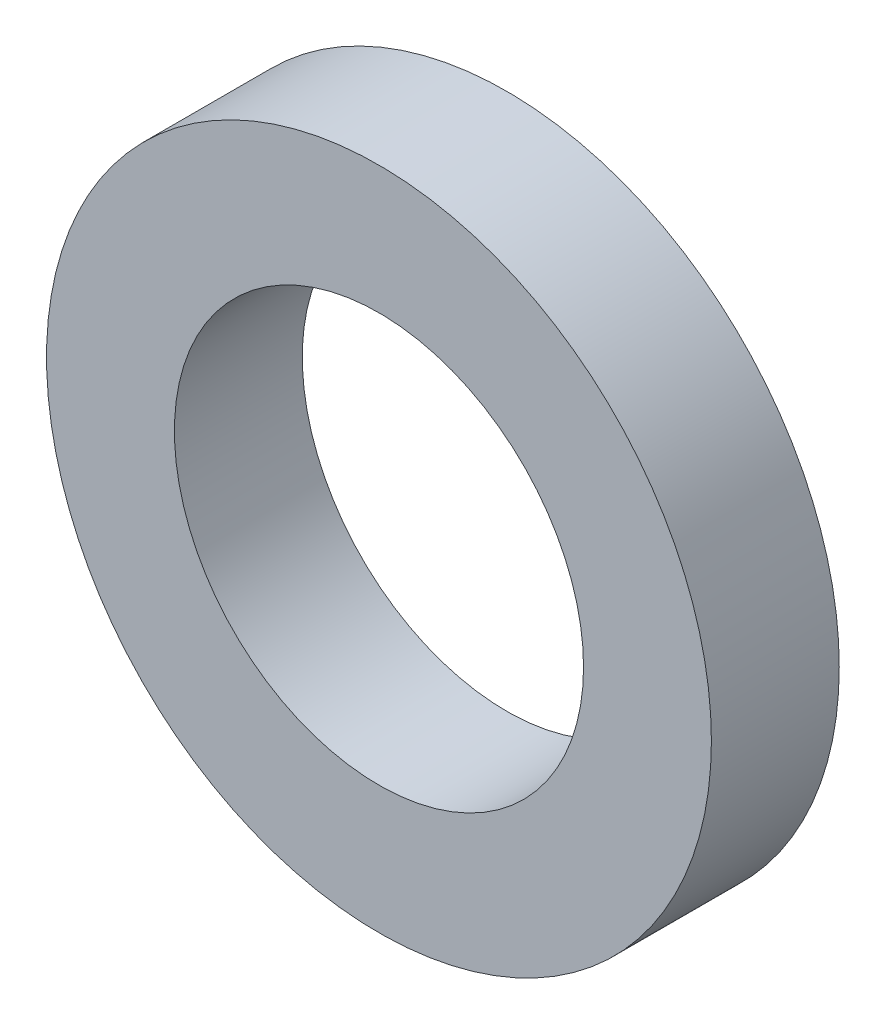
ISO-10303-21;
HEADER;
FILE_DESCRIPTION(('STEP AP214'),'2;1');
FILE_NAME('part.step','',(''),(''),'','','');
FILE_SCHEMA(('AUTOMOTIVE_DESIGN { 1 0 10303 214 1 1 1 1 }'));
ENDSEC;
DATA;
#1=APPLICATION_CONTEXT('core data for automotive mechanical design processes');
#2=APPLICATION_PROTOCOL_DEFINITION('international standard','automotive_design',2000,#1);
#3=PRODUCT_CONTEXT('',#1,'mechanical');
#4=PRODUCT('Part','Part','',(#3));
#5=PRODUCT_RELATED_PRODUCT_CATEGORY('part','',(#4));
#6=PRODUCT_DEFINITION_FORMATION('','',#4);
#7=PRODUCT_DEFINITION_CONTEXT('part definition',#1,'design');
#8=PRODUCT_DEFINITION('design','',#6,#7);
#9=PRODUCT_DEFINITION_SHAPE('','',#8);
#10=(LENGTH_UNIT() NAMED_UNIT(*) SI_UNIT(.MILLI.,.METRE.));
#11=(NAMED_UNIT(*) PLANE_ANGLE_UNIT() SI_UNIT($,.RADIAN.));
#12=(NAMED_UNIT(*) SI_UNIT($,.STERADIAN.) SOLID_ANGLE_UNIT());
#13=UNCERTAINTY_MEASURE_WITH_UNIT(LENGTH_MEASURE(1.E-05),#10,'distance_accuracy_value','');
#14=(GEOMETRIC_REPRESENTATION_CONTEXT(3) GLOBAL_UNCERTAINTY_ASSIGNED_CONTEXT((#13)) GLOBAL_UNIT_ASSIGNED_CONTEXT((#10,
#11,#12)) REPRESENTATION_CONTEXT('',''));
#15=CARTESIAN_POINT('',(0.,0.,0.));
#16=DIRECTION('',(0.,0.,1.));
#17=DIRECTION('',(1.,0.,0.));
#18=AXIS2_PLACEMENT_3D('',#15,#16,#17);
#19=CARTESIAN_POINT('',(0.,0.,1.));
#20=DIRECTION('',(0.,0.,1.));
#21=DIRECTION('',(1.,0.,0.));
#22=AXIS2_PLACEMENT_3D('',#19,#20,#21);
#23=PLANE('',#22);
#24=CARTESIAN_POINT('',(0.,0.,1.));
#25=DIRECTION('',(0.,0.,1.));
#26=DIRECTION('',(1.,0.,0.));
#27=AXIS2_PLACEMENT_3D('',#24,#25,#26);
#28=CIRCLE('',#27,2.6);
#29=CARTESIAN_POINT('',(2.6,0.,1.));
#30=VERTEX_POINT('',#29);
#31=EDGE_CURVE('E10',#30,#30,#28,.T.);
#32=ORIENTED_EDGE('',*,*,#31,.T.);
#33=EDGE_LOOP('',(#32));
#34=FACE_BOUND('',#33,.T.);
#35=CARTESIAN_POINT('',(0.,0.,1.));
#36=DIRECTION('',(0.,0.,1.));
#37=DIRECTION('',(1.,0.,0.));
#38=AXIS2_PLACEMENT_3D('',#35,#36,#37);
#39=CIRCLE('',#38,1.6);
#40=CARTESIAN_POINT('',(1.6,0.,1.));
#41=VERTEX_POINT('',#40);
#42=EDGE_CURVE('E42',#41,#41,#39,.T.);
#43=ORIENTED_EDGE('',*,*,#42,.F.);
#44=EDGE_LOOP('',(#43));
#45=FACE_BOUND('',#44,.T.);
#46=ADVANCED_FACE('F31',(#34,#45),#23,.T.);
#47=CARTESIAN_POINT('',(0.,0.,0.));
#48=DIRECTION('',(0.,0.,1.));
#49=DIRECTION('',(1.,0.,0.));
#50=AXIS2_PLACEMENT_3D('',#47,#48,#49);
#51=PLANE('',#50);
#52=CARTESIAN_POINT('',(0.,0.,0.));
#53=DIRECTION('',(0.,0.,1.));
#54=DIRECTION('',(1.,0.,0.));
#55=AXIS2_PLACEMENT_3D('',#52,#53,#54);
#56=CIRCLE('',#55,2.6);
#57=CARTESIAN_POINT('',(2.6,0.,0.));
#58=VERTEX_POINT('',#57);
#59=EDGE_CURVE('E35',#58,#58,#56,.T.);
#60=ORIENTED_EDGE('',*,*,#59,.F.);
#61=EDGE_LOOP('',(#60));
#62=FACE_BOUND('',#61,.T.);
#63=CARTESIAN_POINT('',(0.,0.,0.));
#64=DIRECTION('',(0.,0.,1.));
#65=DIRECTION('',(1.,0.,0.));
#66=AXIS2_PLACEMENT_3D('',#63,#64,#65);
#67=CIRCLE('',#66,1.6);
#68=CARTESIAN_POINT('',(1.6,0.,0.));
#69=VERTEX_POINT('',#68);
#70=EDGE_CURVE('E44',#69,#69,#67,.T.);
#71=ORIENTED_EDGE('',*,*,#70,.T.);
#72=EDGE_LOOP('',(#71));
#73=FACE_BOUND('',#72,.T.);
#74=ADVANCED_FACE('F54',(#62,#73),#51,.F.);
#75=CARTESIAN_POINT('',(0.,0.,1.));
#76=DIRECTION('',(0.,0.,-1.));
#77=DIRECTION('',(-1.,0.,0.));
#78=AXIS2_PLACEMENT_3D('',#75,#76,#77);
#79=CYLINDRICAL_SURFACE('',#78,2.6);
#80=ORIENTED_EDGE('',*,*,#31,.F.);
#81=EDGE_LOOP('',(#80));
#82=FACE_BOUND('',#81,.T.);
#83=ORIENTED_EDGE('',*,*,#59,.T.);
#84=EDGE_LOOP('',(#83));
#85=FACE_BOUND('',#84,.T.);
#86=ADVANCED_FACE('F33',(#82,#85),#79,.T.);
#87=CARTESIAN_POINT('',(0.,0.,1.));
#88=DIRECTION('',(0.,0.,-1.));
#89=DIRECTION('',(-1.,0.,0.));
#90=AXIS2_PLACEMENT_3D('',#87,#88,#89);
#91=CYLINDRICAL_SURFACE('',#90,1.6);
#92=ORIENTED_EDGE('',*,*,#42,.T.);
#93=EDGE_LOOP('',(#92));
#94=FACE_BOUND('',#93,.T.);
#95=ORIENTED_EDGE('',*,*,#70,.F.);
#96=EDGE_LOOP('',(#95));
#97=FACE_BOUND('',#96,.T.);
#98=ADVANCED_FACE('F50',(#94,#97),#91,.F.);
#99=CLOSED_SHELL('',(#46,#74,#86,#98));
#100=MANIFOLD_SOLID_BREP('B2',#99);
#101=ADVANCED_BREP_SHAPE_REPRESENTATION('',(#18,#100),#14);
#102=SHAPE_DEFINITION_REPRESENTATION(#9,#101);
ENDSEC;
END-ISO-10303-21;
